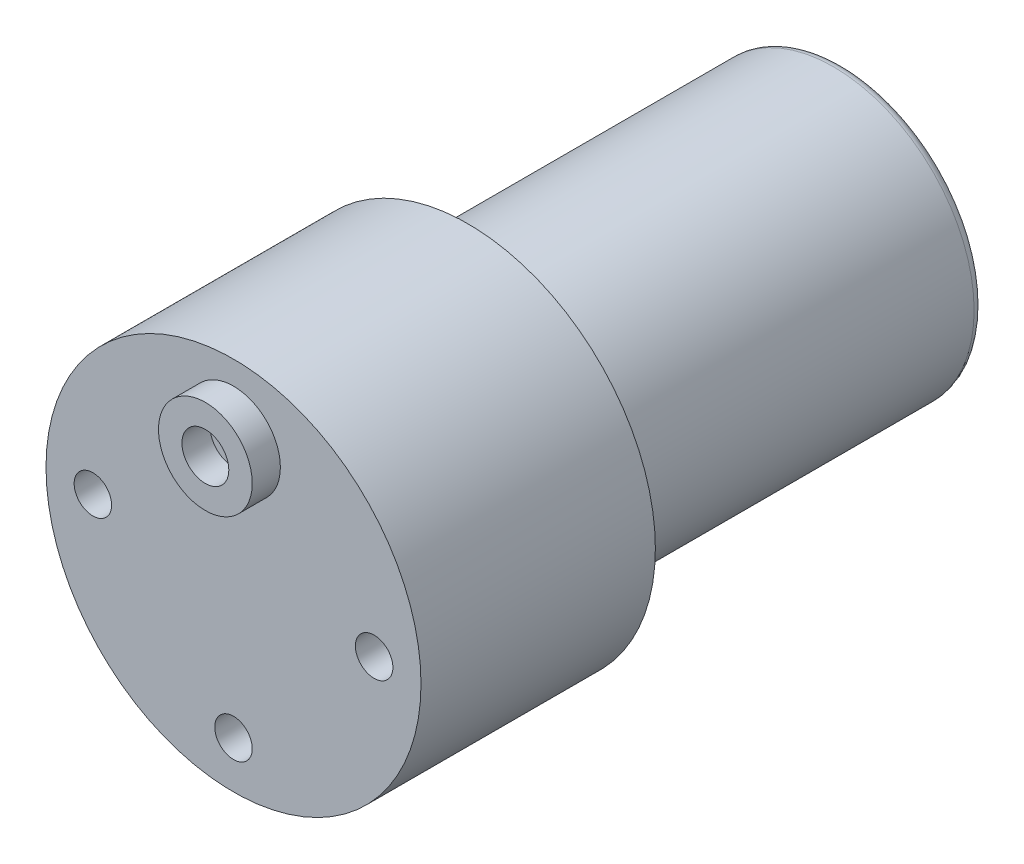
ISO-10303-21;
HEADER;
FILE_DESCRIPTION(('STEP AP214'),'2;1');
FILE_NAME('part.step','',(''),(''),'','','');
FILE_SCHEMA(('AUTOMOTIVE_DESIGN { 1 0 10303 214 1 1 1 1 }'));
ENDSEC;
DATA;
#1=APPLICATION_CONTEXT('core data for automotive mechanical design processes');
#2=APPLICATION_PROTOCOL_DEFINITION('international standard','automotive_design',2000,#1);
#3=PRODUCT_CONTEXT('',#1,'mechanical');
#4=PRODUCT('Part','Part','',(#3));
#5=PRODUCT_RELATED_PRODUCT_CATEGORY('part','',(#4));
#6=PRODUCT_DEFINITION_FORMATION('','',#4);
#7=PRODUCT_DEFINITION_CONTEXT('part definition',#1,'design');
#8=PRODUCT_DEFINITION('design','',#6,#7);
#9=PRODUCT_DEFINITION_SHAPE('','',#8);
#10=(LENGTH_UNIT() NAMED_UNIT(*) SI_UNIT(.MILLI.,.METRE.));
#11=(NAMED_UNIT(*) PLANE_ANGLE_UNIT() SI_UNIT($,.RADIAN.));
#12=(NAMED_UNIT(*) SI_UNIT($,.STERADIAN.) SOLID_ANGLE_UNIT());
#13=UNCERTAINTY_MEASURE_WITH_UNIT(LENGTH_MEASURE(1.E-05),#10,'distance_accuracy_value','');
#14=(GEOMETRIC_REPRESENTATION_CONTEXT(3) GLOBAL_UNCERTAINTY_ASSIGNED_CONTEXT((#13)) GLOBAL_UNIT_ASSIGNED_CONTEXT((#10,
#11,#12)) REPRESENTATION_CONTEXT('',''));
#15=CARTESIAN_POINT('',(0.,0.,0.));
#16=DIRECTION('',(0.,0.,1.));
#17=DIRECTION('',(1.,0.,0.));
#18=AXIS2_PLACEMENT_3D('',#15,#16,#17);
#19=CARTESIAN_POINT('',(0.,0.,0.));
#20=DIRECTION('',(0.,0.,1.));
#21=DIRECTION('',(1.,0.,0.));
#22=AXIS2_PLACEMENT_3D('',#19,#20,#21);
#23=PLANE('',#22);
#24=CARTESIAN_POINT('',(0.,0.,0.));
#25=DIRECTION('',(0.,0.,1.));
#26=DIRECTION('',(1.,0.,0.));
#27=AXIS2_PLACEMENT_3D('',#24,#25,#26);
#28=CIRCLE('',#27,14.);
#29=CARTESIAN_POINT('',(14.,0.,0.));
#30=VERTEX_POINT('',#29);
#31=EDGE_CURVE('E11',#30,#30,#28,.F.);
#32=ORIENTED_EDGE('',*,*,#31,.T.);
#33=EDGE_LOOP('',(#32));
#34=FACE_BOUND('',#33,.T.);
#35=CARTESIAN_POINT('',(0.,0.,0.));
#36=DIRECTION('',(0.,0.,1.));
#37=DIRECTION('',(1.,0.,0.));
#38=AXIS2_PLACEMENT_3D('',#35,#36,#37);
#39=CIRCLE('',#38,0.884543567841177);
#40=CARTESIAN_POINT('',(0.884543567841177,0.,0.));
#41=VERTEX_POINT('',#40);
#42=EDGE_CURVE('E299',#41,#41,#39,.F.);
#43=ORIENTED_EDGE('',*,*,#42,.F.);
#44=EDGE_LOOP('',(#43));
#45=FACE_BOUND('',#44,.T.);
#46=CARTESIAN_POINT('',(0.,0.,0.));
#47=DIRECTION('',(0.,0.,-1.));
#48=DIRECTION('',(-1.,0.,0.));
#49=AXIS2_PLACEMENT_3D('',#46,#47,#48);
#50=CIRCLE('',#49,11.5058602878581);
#51=CARTESIAN_POINT('',(4.21173853395863,10.7072909498752,0.));
#52=VERTEX_POINT('',#51);
#53=CARTESIAN_POINT('',(11.5058602878581,0.,0.));
#54=VERTEX_POINT('',#53);
#55=EDGE_CURVE('E262',#52,#54,#50,.T.);
#56=ORIENTED_EDGE('',*,*,#55,.F.);
#57=DIRECTION('',(0.366051597063384,0.930594556338767,0.));
#58=VECTOR('',#57,1.);
#59=CARTESIAN_POINT('',(0.,0.,0.));
#60=LINE('',#59,#58);
#61=CARTESIAN_POINT('',(3.14924308074473,8.00616222149991,0.));
#62=VERTEX_POINT('',#61);
#63=EDGE_CURVE('E242',#62,#52,#60,.T.);
#64=ORIENTED_EDGE('',*,*,#63,.F.);
#65=CARTESIAN_POINT('',(0.,0.,0.));
#66=DIRECTION('',(0.,0.,-1.));
#67=DIRECTION('',(-1.,0.,0.));
#68=AXIS2_PLACEMENT_3D('',#65,#66,#67);
#69=CIRCLE('',#68,8.60327643974033);
#70=CARTESIAN_POINT('',(8.60327643974033,0.,0.));
#71=VERTEX_POINT('',#70);
#72=EDGE_CURVE('E253',#62,#71,#69,.T.);
#73=ORIENTED_EDGE('',*,*,#72,.T.);
#74=DIRECTION('',(1.,0.,0.));
#75=VECTOR('',#74,1.);
#76=CARTESIAN_POINT('',(0.,0.,0.));
#77=LINE('',#76,#75);
#78=EDGE_CURVE('E265',#71,#54,#77,.T.);
#79=ORIENTED_EDGE('',*,*,#78,.T.);
#80=EDGE_LOOP('',(#56,#64,#73,#79));
#81=FACE_BOUND('',#80,.T.);
#82=CARTESIAN_POINT('',(0.,0.,0.));
#83=DIRECTION('',(0.,0.,-1.));
#84=DIRECTION('',(-1.,0.,0.));
#85=AXIS2_PLACEMENT_3D('',#82,#83,#84);
#86=CIRCLE('',#85,11.5058602878581);
#87=CARTESIAN_POINT('',(10.7834674748527,-4.01268615549543,0.));
#88=VERTEX_POINT('',#87);
#89=CARTESIAN_POINT('',(0.,-11.5058602878581,0.));
#90=VERTEX_POINT('',#89);
#91=EDGE_CURVE('E232',#88,#90,#86,.T.);
#92=ORIENTED_EDGE('',*,*,#91,.F.);
#93=DIRECTION('',(0.937215228159188,-0.348751510543712,0.));
#94=VECTOR('',#93,1.);
#95=CARTESIAN_POINT('',(0.,0.,0.));
#96=LINE('',#95,#94);
#97=CARTESIAN_POINT('',(8.0631216913878,-3.00040565398457,0.));
#98=VERTEX_POINT('',#97);
#99=EDGE_CURVE('E186',#98,#88,#96,.T.);
#100=ORIENTED_EDGE('',*,*,#99,.F.);
#101=CARTESIAN_POINT('',(0.,0.,0.));
#102=DIRECTION('',(0.,0.,-1.));
#103=DIRECTION('',(-1.,0.,0.));
#104=AXIS2_PLACEMENT_3D('',#101,#102,#103);
#105=CIRCLE('',#104,8.60327643974033);
#106=CARTESIAN_POINT('',(0.,-8.60327643974033,0.));
#107=VERTEX_POINT('',#106);
#108=EDGE_CURVE('E223',#98,#107,#105,.T.);
#109=ORIENTED_EDGE('',*,*,#108,.T.);
#110=DIRECTION('',(0.,-1.,0.));
#111=VECTOR('',#110,1.);
#112=CARTESIAN_POINT('',(0.,0.,0.));
#113=LINE('',#112,#111);
#114=EDGE_CURVE('E235',#107,#90,#113,.T.);
#115=ORIENTED_EDGE('',*,*,#114,.T.);
#116=EDGE_LOOP('',(#92,#100,#109,#115));
#117=FACE_BOUND('',#116,.T.);
#118=CARTESIAN_POINT('',(0.,0.,0.));
#119=DIRECTION('',(0.,0.,-1.));
#120=DIRECTION('',(-1.,0.,0.));
#121=AXIS2_PLACEMENT_3D('',#118,#119,#120);
#122=CIRCLE('',#121,11.5058602878581);
#123=CARTESIAN_POINT('',(-4.01268615549543,-10.7834674748527,0.));
#124=VERTEX_POINT('',#123);
#125=CARTESIAN_POINT('',(-11.5058602878581,0.,0.));
#126=VERTEX_POINT('',#125);
#127=EDGE_CURVE('E179',#124,#126,#122,.T.);
#128=ORIENTED_EDGE('',*,*,#127,.F.);
#129=DIRECTION('',(-0.311725125450202,-0.950172324456493,0.));
#130=VECTOR('',#129,1.);
#131=CARTESIAN_POINT('',(-0.428780065375972,0.140670819628772,0.));
#132=LINE('',#131,#130);
#133=CARTESIAN_POINT('',(-3.10694566550822,-8.02267125901159,0.));
#134=VERTEX_POINT('',#133);
#135=EDGE_CURVE('E57',#134,#124,#132,.T.);
#136=ORIENTED_EDGE('',*,*,#135,.F.);
#137=CARTESIAN_POINT('',(0.,0.,0.));
#138=DIRECTION('',(0.,0.,-1.));
#139=DIRECTION('',(-1.,0.,0.));
#140=AXIS2_PLACEMENT_3D('',#137,#138,#139);
#141=CIRCLE('',#140,8.60327643974033);
#142=CARTESIAN_POINT('',(-8.60327643974033,0.,0.));
#143=VERTEX_POINT('',#142);
#144=EDGE_CURVE('E167',#134,#143,#141,.T.);
#145=ORIENTED_EDGE('',*,*,#144,.T.);
#146=DIRECTION('',(-1.,0.,0.));
#147=VECTOR('',#146,1.);
#148=CARTESIAN_POINT('',(0.,0.,0.));
#149=LINE('',#148,#147);
#150=EDGE_CURVE('E170',#143,#126,#149,.T.);
#151=ORIENTED_EDGE('',*,*,#150,.T.);
#152=EDGE_LOOP('',(#128,#136,#145,#151));
#153=FACE_BOUND('',#152,.T.);
#154=CARTESIAN_POINT('',(0.,0.,0.));
#155=DIRECTION('',(0.,0.,-1.));
#156=DIRECTION('',(-1.,0.,0.));
#157=AXIS2_PLACEMENT_3D('',#154,#155,#156);
#158=CIRCLE('',#157,8.60327643974033);
#159=CARTESIAN_POINT('',(-7.89783511164913,3.41182737661111,0.));
#160=VERTEX_POINT('',#159);
#161=CARTESIAN_POINT('',(0.,8.60327643974033,0.));
#162=VERTEX_POINT('',#161);
#163=EDGE_CURVE('E49',#160,#162,#158,.T.);
#164=ORIENTED_EDGE('',*,*,#163,.T.);
#165=DIRECTION('',(0.,1.,0.));
#166=VECTOR('',#165,1.);
#167=CARTESIAN_POINT('',(0.,0.,0.));
#168=LINE('',#167,#166);
#169=CARTESIAN_POINT('',(0.,11.5058602878581,0.));
#170=VERTEX_POINT('',#169);
#171=EDGE_CURVE('E194',#162,#170,#168,.T.);
#172=ORIENTED_EDGE('',*,*,#171,.T.);
#173=CARTESIAN_POINT('',(0.,0.,0.));
#174=DIRECTION('',(0.,0.,-1.));
#175=DIRECTION('',(-1.,0.,0.));
#176=AXIS2_PLACEMENT_3D('',#173,#174,#175);
#177=CIRCLE('',#176,11.5058602878581);
#178=CARTESIAN_POINT('',(-10.5624163082127,4.56291383829598,0.));
#179=VERTEX_POINT('',#178);
#180=EDGE_CURVE('E208',#179,#170,#177,.T.);
#181=ORIENTED_EDGE('',*,*,#180,.F.);
#182=DIRECTION('',(-0.918003177855287,0.396573026626365,0.));
#183=VECTOR('',#182,1.);
#184=CARTESIAN_POINT('',(0.,0.,0.));
#185=LINE('',#184,#183);
#186=EDGE_CURVE('E204',#160,#179,#185,.T.);
#187=ORIENTED_EDGE('',*,*,#186,.F.);
#188=EDGE_LOOP('',(#164,#172,#181,#187));
#189=FACE_BOUND('',#188,.T.);
#190=ADVANCED_FACE('F34',(#34,#45,#81,#117,#153,#189),#23,.F.);
#191=CARTESIAN_POINT('',(0.,0.,40.));
#192=DIRECTION('',(0.,0.,-1.));
#193=DIRECTION('',(-1.,0.,0.));
#194=AXIS2_PLACEMENT_3D('',#191,#192,#193);
#195=CYLINDRICAL_SURFACE('',#194,15.);
#196=CARTESIAN_POINT('',(0.,0.,1.));
#197=DIRECTION('',(0.,0.,1.));
#198=DIRECTION('',(1.,0.,0.));
#199=AXIS2_PLACEMENT_3D('',#196,#197,#198);
#200=CIRCLE('',#199,15.);
#201=CARTESIAN_POINT('',(15.,0.,1.));
#202=VERTEX_POINT('',#201);
#203=EDGE_CURVE('E42',#202,#202,#200,.T.);
#204=ORIENTED_EDGE('',*,*,#203,.T.);
#205=EDGE_LOOP('',(#204));
#206=FACE_BOUND('',#205,.T.);
#207=CARTESIAN_POINT('',(0.,0.,40.));
#208=DIRECTION('',(0.,0.,1.));
#209=DIRECTION('',(1.,0.,0.));
#210=AXIS2_PLACEMENT_3D('',#207,#208,#209);
#211=CIRCLE('',#210,15.);
#212=CARTESIAN_POINT('',(15.,0.,40.));
#213=VERTEX_POINT('',#212);
#214=EDGE_CURVE('E294',#213,#213,#211,.T.);
#215=ORIENTED_EDGE('',*,*,#214,.F.);
#216=EDGE_LOOP('',(#215));
#217=FACE_BOUND('',#216,.T.);
#218=ADVANCED_FACE('F307',(#206,#217),#195,.T.);
#219=CARTESIAN_POINT('',(0.,0.,65.));
#220=DIRECTION('',(0.,0.,-1.));
#221=DIRECTION('',(-1.,0.,0.));
#222=AXIS2_PLACEMENT_3D('',#219,#220,#221);
#223=CYLINDRICAL_SURFACE('',#222,20.);
#224=CARTESIAN_POINT('',(0.,0.,65.));
#225=DIRECTION('',(0.,0.,1.));
#226=DIRECTION('',(1.,0.,0.));
#227=AXIS2_PLACEMENT_3D('',#224,#225,#226);
#228=CIRCLE('',#227,20.);
#229=CARTESIAN_POINT('',(20.,0.,65.));
#230=VERTEX_POINT('',#229);
#231=EDGE_CURVE('E291',#230,#230,#228,.T.);
#232=ORIENTED_EDGE('',*,*,#231,.F.);
#233=EDGE_LOOP('',(#232));
#234=FACE_BOUND('',#233,.T.);
#235=CARTESIAN_POINT('',(0.,0.,40.));
#236=DIRECTION('',(0.,0.,1.));
#237=DIRECTION('',(1.,0.,0.));
#238=AXIS2_PLACEMENT_3D('',#235,#236,#237);
#239=CIRCLE('',#238,20.);
#240=CARTESIAN_POINT('',(20.,0.,40.));
#241=VERTEX_POINT('',#240);
#242=EDGE_CURVE('E290',#241,#241,#239,.T.);
#243=ORIENTED_EDGE('',*,*,#242,.T.);
#244=EDGE_LOOP('',(#243));
#245=FACE_BOUND('',#244,.T.);
#246=ADVANCED_FACE('F331',(#234,#245),#223,.T.);
#247=CARTESIAN_POINT('',(0.,0.,65.));
#248=DIRECTION('',(0.,0.,1.));
#249=DIRECTION('',(1.,0.,0.));
#250=AXIS2_PLACEMENT_3D('',#247,#248,#249);
#251=PLANE('',#250);
#252=CARTESIAN_POINT('',(-15.,0.,65.));
#253=DIRECTION('',(0.,0.,1.));
#254=DIRECTION('',(1.,0.,0.));
#255=AXIS2_PLACEMENT_3D('',#252,#253,#254);
#256=CIRCLE('',#255,2.);
#257=CARTESIAN_POINT('',(-13.,0.,65.));
#258=VERTEX_POINT('',#257);
#259=EDGE_CURVE('E457',#258,#258,#256,.T.);
#260=ORIENTED_EDGE('',*,*,#259,.F.);
#261=EDGE_LOOP('',(#260));
#262=FACE_BOUND('',#261,.T.);
#263=CARTESIAN_POINT('',(0.,-15.,65.));
#264=DIRECTION('',(0.,0.,1.));
#265=DIRECTION('',(1.,0.,0.));
#266=AXIS2_PLACEMENT_3D('',#263,#264,#265);
#267=CIRCLE('',#266,2.);
#268=CARTESIAN_POINT('',(2.,-15.,65.));
#269=VERTEX_POINT('',#268);
#270=EDGE_CURVE('E466',#269,#269,#267,.T.);
#271=ORIENTED_EDGE('',*,*,#270,.F.);
#272=EDGE_LOOP('',(#271));
#273=FACE_BOUND('',#272,.T.);
#274=CARTESIAN_POINT('',(15.,0.,65.));
#275=DIRECTION('',(0.,0.,1.));
#276=DIRECTION('',(1.,0.,0.));
#277=AXIS2_PLACEMENT_3D('',#274,#275,#276);
#278=CIRCLE('',#277,2.);
#279=CARTESIAN_POINT('',(17.,0.,65.));
#280=VERTEX_POINT('',#279);
#281=EDGE_CURVE('E173',#280,#280,#278,.T.);
#282=ORIENTED_EDGE('',*,*,#281,.F.);
#283=EDGE_LOOP('',(#282));
#284=FACE_BOUND('',#283,.T.);
#285=CARTESIAN_POINT('',(0.,12.5,65.));
#286=DIRECTION('',(0.,0.,1.));
#287=DIRECTION('',(1.,0.,0.));
#288=AXIS2_PLACEMENT_3D('',#285,#286,#287);
#289=CIRCLE('',#288,5.);
#290=CARTESIAN_POINT('',(5.,12.5,65.));
#291=VERTEX_POINT('',#290);
#292=EDGE_CURVE('E281',#291,#291,#289,.T.);
#293=ORIENTED_EDGE('',*,*,#292,.F.);
#294=EDGE_LOOP('',(#293));
#295=FACE_BOUND('',#294,.T.);
#296=ORIENTED_EDGE('',*,*,#231,.T.);
#297=EDGE_LOOP('',(#296));
#298=FACE_BOUND('',#297,.T.);
#299=ADVANCED_FACE('F336',(#262,#273,#284,#295,#298),#251,.T.);
#300=CARTESIAN_POINT('',(0.,0.,40.));
#301=DIRECTION('',(0.,0.,1.));
#302=DIRECTION('',(1.,0.,0.));
#303=AXIS2_PLACEMENT_3D('',#300,#301,#302);
#304=PLANE('',#303);
#305=ORIENTED_EDGE('',*,*,#214,.T.);
#306=EDGE_LOOP('',(#305));
#307=FACE_BOUND('',#306,.T.);
#308=ORIENTED_EDGE('',*,*,#242,.F.);
#309=EDGE_LOOP('',(#308));
#310=FACE_BOUND('',#309,.T.);
#311=ADVANCED_FACE('F338',(#307,#310),#304,.F.);
#312=CARTESIAN_POINT('',(0.,0.,-3.));
#313=DIRECTION('',(0.,0.,1.));
#314=DIRECTION('',(1.,0.,0.));
#315=AXIS2_PLACEMENT_3D('',#312,#313,#314);
#316=CYLINDRICAL_SURFACE('',#315,0.884543567841177);
#317=CARTESIAN_POINT('',(0.,0.,-3.));
#318=DIRECTION('',(0.,0.,-1.));
#319=DIRECTION('',(-1.,0.,0.));
#320=AXIS2_PLACEMENT_3D('',#317,#318,#319);
#321=CIRCLE('',#320,0.884543567841177);
#322=CARTESIAN_POINT('',(-0.884543567841177,0.,-3.));
#323=VERTEX_POINT('',#322);
#324=EDGE_CURVE('E285',#323,#323,#321,.T.);
#325=ORIENTED_EDGE('',*,*,#324,.F.);
#326=EDGE_LOOP('',(#325));
#327=FACE_BOUND('',#326,.T.);
#328=ORIENTED_EDGE('',*,*,#42,.T.);
#329=EDGE_LOOP('',(#328));
#330=FACE_BOUND('',#329,.T.);
#331=ADVANCED_FACE('F341',(#327,#330),#316,.T.);
#332=CARTESIAN_POINT('',(0.,0.,-3.));
#333=DIRECTION('',(0.,0.,-1.));
#334=DIRECTION('',(-1.,0.,0.));
#335=AXIS2_PLACEMENT_3D('',#332,#333,#334);
#336=PLANE('',#335);
#337=ORIENTED_EDGE('',*,*,#324,.T.);
#338=EDGE_LOOP('',(#337));
#339=FACE_BOUND('',#338,.T.);
#340=ADVANCED_FACE('F349',(#339),#336,.T.);
#341=CARTESIAN_POINT('',(0.,12.5,68.));
#342=DIRECTION('',(0.,0.,1.));
#343=DIRECTION('',(1.,0.,0.));
#344=AXIS2_PLACEMENT_3D('',#341,#342,#343);
#345=PLANE('',#344);
#346=CARTESIAN_POINT('',(0.,12.5,68.));
#347=DIRECTION('',(0.,0.,1.));
#348=DIRECTION('',(1.,0.,0.));
#349=AXIS2_PLACEMENT_3D('',#346,#347,#348);
#350=CIRCLE('',#349,5.);
#351=CARTESIAN_POINT('',(5.,12.5,68.));
#352=VERTEX_POINT('',#351);
#353=EDGE_CURVE('E282',#352,#352,#350,.T.);
#354=ORIENTED_EDGE('',*,*,#353,.T.);
#355=EDGE_LOOP('',(#354));
#356=FACE_BOUND('',#355,.T.);
#357=CARTESIAN_POINT('',(0.,12.5,68.));
#358=DIRECTION('',(0.,0.,1.));
#359=DIRECTION('',(1.,0.,0.));
#360=AXIS2_PLACEMENT_3D('',#357,#358,#359);
#361=CIRCLE('',#360,2.5);
#362=CARTESIAN_POINT('',(2.5,12.5,68.));
#363=VERTEX_POINT('',#362);
#364=EDGE_CURVE('E272',#363,#363,#361,.T.);
#365=ORIENTED_EDGE('',*,*,#364,.F.);
#366=EDGE_LOOP('',(#365));
#367=FACE_BOUND('',#366,.T.);
#368=ADVANCED_FACE('F353',(#356,#367),#345,.T.);
#369=CARTESIAN_POINT('',(0.,12.5,68.));
#370=DIRECTION('',(0.,0.,-1.));
#371=DIRECTION('',(-1.,0.,0.));
#372=AXIS2_PLACEMENT_3D('',#369,#370,#371);
#373=CYLINDRICAL_SURFACE('',#372,5.);
#374=ORIENTED_EDGE('',*,*,#353,.F.);
#375=EDGE_LOOP('',(#374));
#376=FACE_BOUND('',#375,.T.);
#377=ORIENTED_EDGE('',*,*,#292,.T.);
#378=EDGE_LOOP('',(#377));
#379=FACE_BOUND('',#378,.T.);
#380=ADVANCED_FACE('F355',(#376,#379),#373,.T.);
#381=CARTESIAN_POINT('',(0.,12.5,68.));
#382=DIRECTION('',(0.,0.,-1.));
#383=DIRECTION('',(-1.,0.,0.));
#384=AXIS2_PLACEMENT_3D('',#381,#382,#383);
#385=CYLINDRICAL_SURFACE('',#384,2.5);
#386=ORIENTED_EDGE('',*,*,#364,.T.);
#387=EDGE_LOOP('',(#386));
#388=FACE_BOUND('',#387,.T.);
#389=CARTESIAN_POINT('',(0.,12.5,65.));
#390=DIRECTION('',(0.,0.,1.));
#391=DIRECTION('',(1.,0.,0.));
#392=AXIS2_PLACEMENT_3D('',#389,#390,#391);
#393=CIRCLE('',#392,2.5);
#394=CARTESIAN_POINT('',(2.5,12.5,65.));
#395=VERTEX_POINT('',#394);
#396=EDGE_CURVE('E302',#395,#395,#393,.F.);
#397=ORIENTED_EDGE('',*,*,#396,.T.);
#398=EDGE_LOOP('',(#397));
#399=FACE_BOUND('',#398,.T.);
#400=ADVANCED_FACE('F358',(#388,#399),#385,.F.);
#401=ORIENTED_EDGE('',*,*,#396,.F.);
#402=EDGE_LOOP('',(#401));
#403=FACE_BOUND('',#402,.T.);
#404=ADVANCED_FACE('F346',(#403),#251,.T.);
#405=CARTESIAN_POINT('',(0.,0.,3.));
#406=DIRECTION('',(-0.930594556338767,0.366051597063384,0.));
#407=DIRECTION('',(-0.366051597063384,-0.930594556338767,0.));
#408=AXIS2_PLACEMENT_3D('',#405,#406,#407);
#409=PLANE('',#408);
#410=ORIENTED_EDGE('',*,*,#63,.T.);
#411=DIRECTION('',(0.,0.,-1.));
#412=VECTOR('',#411,1.);
#413=CARTESIAN_POINT('',(4.21173853395863,10.7072909498752,3.));
#414=LINE('',#413,#412);
#415=CARTESIAN_POINT('',(4.21173853395863,10.7072909498752,3.));
#416=VERTEX_POINT('',#415);
#417=EDGE_CURVE('E260',#416,#52,#414,.T.);
#418=ORIENTED_EDGE('',*,*,#417,.F.);
#419=DIRECTION('',(0.366051597063384,0.930594556338767,0.));
#420=VECTOR('',#419,1.);
#421=CARTESIAN_POINT('',(0.,0.,3.));
#422=LINE('',#421,#420);
#423=CARTESIAN_POINT('',(3.14924308074473,8.00616222149991,3.));
#424=VERTEX_POINT('',#423);
#425=EDGE_CURVE('E249',#424,#416,#422,.T.);
#426=ORIENTED_EDGE('',*,*,#425,.F.);
#427=DIRECTION('',(0.,0.,-1.));
#428=VECTOR('',#427,1.);
#429=CARTESIAN_POINT('',(3.14924308074473,8.00616222149991,3.));
#430=LINE('',#429,#428);
#431=EDGE_CURVE('E270',#424,#62,#430,.T.);
#432=ORIENTED_EDGE('',*,*,#431,.T.);
#433=EDGE_LOOP('',(#410,#418,#426,#432));
#434=FACE_BOUND('',#433,.T.);
#435=ADVANCED_FACE('F366',(#434),#409,.F.);
#436=CARTESIAN_POINT('',(0.,0.,3.));
#437=DIRECTION('',(0.,0.,-1.));
#438=DIRECTION('',(-1.,0.,0.));
#439=AXIS2_PLACEMENT_3D('',#436,#437,#438);
#440=CYLINDRICAL_SURFACE('',#439,8.60327643974033);
#441=ORIENTED_EDGE('',*,*,#72,.F.);
#442=ORIENTED_EDGE('',*,*,#431,.F.);
#443=CARTESIAN_POINT('',(0.,0.,3.));
#444=DIRECTION('',(0.,0.,-1.));
#445=DIRECTION('',(-1.,0.,0.));
#446=AXIS2_PLACEMENT_3D('',#443,#444,#445);
#447=CIRCLE('',#446,8.60327643974033);
#448=CARTESIAN_POINT('',(8.60327643974033,0.,3.));
#449=VERTEX_POINT('',#448);
#450=EDGE_CURVE('E258',#424,#449,#447,.T.);
#451=ORIENTED_EDGE('',*,*,#450,.T.);
#452=DIRECTION('',(0.,0.,-1.));
#453=VECTOR('',#452,1.);
#454=CARTESIAN_POINT('',(8.60327643974033,0.,3.));
#455=LINE('',#454,#453);
#456=EDGE_CURVE('E273',#449,#71,#455,.T.);
#457=ORIENTED_EDGE('',*,*,#456,.T.);
#458=EDGE_LOOP('',(#441,#442,#451,#457));
#459=FACE_BOUND('',#458,.T.);
#460=ADVANCED_FACE('F369',(#459),#440,.T.);
#461=CARTESIAN_POINT('',(0.,0.,3.));
#462=DIRECTION('',(0.,1.,0.));
#463=DIRECTION('',(0.,0.,1.));
#464=AXIS2_PLACEMENT_3D('',#461,#462,#463);
#465=PLANE('',#464);
#466=ORIENTED_EDGE('',*,*,#78,.F.);
#467=ORIENTED_EDGE('',*,*,#456,.F.);
#468=DIRECTION('',(1.,0.,0.));
#469=VECTOR('',#468,1.);
#470=CARTESIAN_POINT('',(0.,0.,3.));
#471=LINE('',#470,#469);
#472=CARTESIAN_POINT('',(11.5058602878581,0.,3.));
#473=VERTEX_POINT('',#472);
#474=EDGE_CURVE('E256',#449,#473,#471,.T.);
#475=ORIENTED_EDGE('',*,*,#474,.T.);
#476=DIRECTION('',(0.,0.,-1.));
#477=VECTOR('',#476,1.);
#478=CARTESIAN_POINT('',(11.5058602878581,0.,3.));
#479=LINE('',#478,#477);
#480=EDGE_CURVE('E275',#473,#54,#479,.T.);
#481=ORIENTED_EDGE('',*,*,#480,.T.);
#482=EDGE_LOOP('',(#466,#467,#475,#481));
#483=FACE_BOUND('',#482,.T.);
#484=ADVANCED_FACE('F375',(#483),#465,.T.);
#485=CARTESIAN_POINT('',(0.,0.,3.));
#486=DIRECTION('',(0.,0.,-1.));
#487=DIRECTION('',(-1.,0.,0.));
#488=AXIS2_PLACEMENT_3D('',#485,#486,#487);
#489=CYLINDRICAL_SURFACE('',#488,11.5058602878581);
#490=ORIENTED_EDGE('',*,*,#55,.T.);
#491=ORIENTED_EDGE('',*,*,#480,.F.);
#492=CARTESIAN_POINT('',(0.,0.,3.));
#493=DIRECTION('',(0.,0.,-1.));
#494=DIRECTION('',(-1.,0.,0.));
#495=AXIS2_PLACEMENT_3D('',#492,#493,#494);
#496=CIRCLE('',#495,11.5058602878581);
#497=EDGE_CURVE('E252',#416,#473,#496,.T.);
#498=ORIENTED_EDGE('',*,*,#497,.F.);
#499=ORIENTED_EDGE('',*,*,#417,.T.);
#500=EDGE_LOOP('',(#490,#491,#498,#499));
#501=FACE_BOUND('',#500,.T.);
#502=ADVANCED_FACE('F371',(#501),#489,.F.);
#503=CARTESIAN_POINT('',(0.,0.,3.));
#504=DIRECTION('',(0.,0.,-1.));
#505=DIRECTION('',(-1.,0.,0.));
#506=AXIS2_PLACEMENT_3D('',#503,#504,#505);
#507=PLANE('',#506);
#508=ORIENTED_EDGE('',*,*,#425,.T.);
#509=ORIENTED_EDGE('',*,*,#497,.T.);
#510=ORIENTED_EDGE('',*,*,#474,.F.);
#511=ORIENTED_EDGE('',*,*,#450,.F.);
#512=EDGE_LOOP('',(#508,#509,#510,#511));
#513=FACE_BOUND('',#512,.T.);
#514=ADVANCED_FACE('F374',(#513),#507,.T.);
#515=CARTESIAN_POINT('',(0.,0.,3.));
#516=DIRECTION('',(0.348751510543712,0.937215228159188,0.));
#517=DIRECTION('',(-0.937215228159188,0.348751510543712,0.));
#518=AXIS2_PLACEMENT_3D('',#515,#516,#517);
#519=PLANE('',#518);
#520=ORIENTED_EDGE('',*,*,#99,.T.);
#521=DIRECTION('',(0.,0.,-1.));
#522=VECTOR('',#521,1.);
#523=CARTESIAN_POINT('',(10.7834674748527,-4.01268615549543,3.));
#524=LINE('',#523,#522);
#525=CARTESIAN_POINT('',(10.7834674748527,-4.01268615549543,3.));
#526=VERTEX_POINT('',#525);
#527=EDGE_CURVE('E230',#526,#88,#524,.T.);
#528=ORIENTED_EDGE('',*,*,#527,.F.);
#529=DIRECTION('',(0.937215228159188,-0.348751510543712,0.));
#530=VECTOR('',#529,1.);
#531=CARTESIAN_POINT('',(0.,0.,3.));
#532=LINE('',#531,#530);
#533=CARTESIAN_POINT('',(8.0631216913878,-3.00040565398457,3.));
#534=VERTEX_POINT('',#533);
#535=EDGE_CURVE('E219',#534,#526,#532,.T.);
#536=ORIENTED_EDGE('',*,*,#535,.F.);
#537=DIRECTION('',(0.,0.,-1.));
#538=VECTOR('',#537,1.);
#539=CARTESIAN_POINT('',(8.0631216913878,-3.00040565398457,3.));
#540=LINE('',#539,#538);
#541=EDGE_CURVE('E240',#534,#98,#540,.T.);
#542=ORIENTED_EDGE('',*,*,#541,.T.);
#543=EDGE_LOOP('',(#520,#528,#536,#542));
#544=FACE_BOUND('',#543,.T.);
#545=ADVANCED_FACE('F385',(#544),#519,.F.);
#546=CARTESIAN_POINT('',(0.,0.,3.));
#547=DIRECTION('',(0.,0.,-1.));
#548=DIRECTION('',(-1.,0.,0.));
#549=AXIS2_PLACEMENT_3D('',#546,#547,#548);
#550=CYLINDRICAL_SURFACE('',#549,8.60327643974033);
#551=ORIENTED_EDGE('',*,*,#108,.F.);
#552=ORIENTED_EDGE('',*,*,#541,.F.);
#553=CARTESIAN_POINT('',(0.,0.,3.));
#554=DIRECTION('',(0.,0.,-1.));
#555=DIRECTION('',(-1.,0.,0.));
#556=AXIS2_PLACEMENT_3D('',#553,#554,#555);
#557=CIRCLE('',#556,8.60327643974033);
#558=CARTESIAN_POINT('',(0.,-8.60327643974033,3.));
#559=VERTEX_POINT('',#558);
#560=EDGE_CURVE('E228',#534,#559,#557,.T.);
#561=ORIENTED_EDGE('',*,*,#560,.T.);
#562=DIRECTION('',(0.,0.,-1.));
#563=VECTOR('',#562,1.);
#564=CARTESIAN_POINT('',(0.,-8.60327643974033,3.));
#565=LINE('',#564,#563);
#566=EDGE_CURVE('E243',#559,#107,#565,.T.);
#567=ORIENTED_EDGE('',*,*,#566,.T.);
#568=EDGE_LOOP('',(#551,#552,#561,#567));
#569=FACE_BOUND('',#568,.T.);
#570=ADVANCED_FACE('F389',(#569),#550,.T.);
#571=CARTESIAN_POINT('',(0.,0.,3.));
#572=DIRECTION('',(1.,0.,0.));
#573=DIRECTION('',(0.,0.,-1.));
#574=AXIS2_PLACEMENT_3D('',#571,#572,#573);
#575=PLANE('',#574);
#576=ORIENTED_EDGE('',*,*,#114,.F.);
#577=ORIENTED_EDGE('',*,*,#566,.F.);
#578=DIRECTION('',(0.,-1.,0.));
#579=VECTOR('',#578,1.);
#580=CARTESIAN_POINT('',(0.,0.,3.));
#581=LINE('',#580,#579);
#582=CARTESIAN_POINT('',(0.,-11.5058602878581,3.));
#583=VERTEX_POINT('',#582);
#584=EDGE_CURVE('E226',#559,#583,#581,.T.);
#585=ORIENTED_EDGE('',*,*,#584,.T.);
#586=DIRECTION('',(0.,0.,-1.));
#587=VECTOR('',#586,1.);
#588=CARTESIAN_POINT('',(0.,-11.5058602878581,3.));
#589=LINE('',#588,#587);
#590=EDGE_CURVE('E245',#583,#90,#589,.T.);
#591=ORIENTED_EDGE('',*,*,#590,.T.);
#592=EDGE_LOOP('',(#576,#577,#585,#591));
#593=FACE_BOUND('',#592,.T.);
#594=ADVANCED_FACE('F395',(#593),#575,.T.);
#595=CARTESIAN_POINT('',(0.,0.,3.));
#596=DIRECTION('',(0.,0.,-1.));
#597=DIRECTION('',(-1.,0.,0.));
#598=AXIS2_PLACEMENT_3D('',#595,#596,#597);
#599=CYLINDRICAL_SURFACE('',#598,11.5058602878581);
#600=ORIENTED_EDGE('',*,*,#91,.T.);
#601=ORIENTED_EDGE('',*,*,#590,.F.);
#602=CARTESIAN_POINT('',(0.,0.,3.));
#603=DIRECTION('',(0.,0.,-1.));
#604=DIRECTION('',(-1.,0.,0.));
#605=AXIS2_PLACEMENT_3D('',#602,#603,#604);
#606=CIRCLE('',#605,11.5058602878581);
#607=EDGE_CURVE('E222',#526,#583,#606,.T.);
#608=ORIENTED_EDGE('',*,*,#607,.F.);
#609=ORIENTED_EDGE('',*,*,#527,.T.);
#610=EDGE_LOOP('',(#600,#601,#608,#609));
#611=FACE_BOUND('',#610,.T.);
#612=ADVANCED_FACE('F391',(#611),#599,.F.);
#613=CARTESIAN_POINT('',(0.,0.,3.));
#614=DIRECTION('',(0.,0.,-1.));
#615=DIRECTION('',(-1.,0.,0.));
#616=AXIS2_PLACEMENT_3D('',#613,#614,#615);
#617=PLANE('',#616);
#618=ORIENTED_EDGE('',*,*,#535,.T.);
#619=ORIENTED_EDGE('',*,*,#607,.T.);
#620=ORIENTED_EDGE('',*,*,#584,.F.);
#621=ORIENTED_EDGE('',*,*,#560,.F.);
#622=EDGE_LOOP('',(#618,#619,#620,#621));
#623=FACE_BOUND('',#622,.T.);
#624=ADVANCED_FACE('F394',(#623),#617,.T.);
#625=CARTESIAN_POINT('',(-0.428780065375972,0.140670819628772,3.));
#626=DIRECTION('',(0.950172324456493,-0.311725125450202,0.));
#627=DIRECTION('',(0.311725125450202,0.950172324456493,0.));
#628=AXIS2_PLACEMENT_3D('',#625,#626,#627);
#629=PLANE('',#628);
#630=ORIENTED_EDGE('',*,*,#135,.T.);
#631=DIRECTION('',(0.,0.,-1.));
#632=VECTOR('',#631,1.);
#633=CARTESIAN_POINT('',(-4.01268615549543,-10.7834674748527,3.));
#634=LINE('',#633,#632);
#635=CARTESIAN_POINT('',(-4.01268615549543,-10.7834674748527,3.));
#636=VERTEX_POINT('',#635);
#637=EDGE_CURVE('E146',#636,#124,#634,.T.);
#638=ORIENTED_EDGE('',*,*,#637,.F.);
#639=DIRECTION('',(-0.311725125450202,-0.950172324456493,0.));
#640=VECTOR('',#639,1.);
#641=CARTESIAN_POINT('',(-0.428780065375972,0.140670819628772,3.));
#642=LINE('',#641,#640);
#643=CARTESIAN_POINT('',(-3.10694566550822,-8.02267125901159,3.));
#644=VERTEX_POINT('',#643);
#645=EDGE_CURVE('E150',#644,#636,#642,.T.);
#646=ORIENTED_EDGE('',*,*,#645,.F.);
#647=DIRECTION('',(0.,0.,-1.));
#648=VECTOR('',#647,1.);
#649=CARTESIAN_POINT('',(-3.10694566550822,-8.02267125901159,3.));
#650=LINE('',#649,#648);
#651=EDGE_CURVE('E184',#644,#134,#650,.T.);
#652=ORIENTED_EDGE('',*,*,#651,.T.);
#653=EDGE_LOOP('',(#630,#638,#646,#652));
#654=FACE_BOUND('',#653,.T.);
#655=ADVANCED_FACE('F148',(#654),#629,.F.);
#656=CARTESIAN_POINT('',(0.,0.,3.));
#657=DIRECTION('',(0.,0.,-1.));
#658=DIRECTION('',(-1.,0.,0.));
#659=AXIS2_PLACEMENT_3D('',#656,#657,#658);
#660=CYLINDRICAL_SURFACE('',#659,8.60327643974033);
#661=ORIENTED_EDGE('',*,*,#144,.F.);
#662=ORIENTED_EDGE('',*,*,#651,.F.);
#663=CARTESIAN_POINT('',(0.,0.,3.));
#664=DIRECTION('',(0.,0.,-1.));
#665=DIRECTION('',(-1.,0.,0.));
#666=AXIS2_PLACEMENT_3D('',#663,#664,#665);
#667=CIRCLE('',#666,8.60327643974033);
#668=CARTESIAN_POINT('',(-8.60327643974033,0.,3.));
#669=VERTEX_POINT('',#668);
#670=EDGE_CURVE('E155',#644,#669,#667,.T.);
#671=ORIENTED_EDGE('',*,*,#670,.T.);
#672=DIRECTION('',(0.,0.,-1.));
#673=VECTOR('',#672,1.);
#674=CARTESIAN_POINT('',(-8.60327643974033,0.,3.));
#675=LINE('',#674,#673);
#676=EDGE_CURVE('E187',#669,#143,#675,.T.);
#677=ORIENTED_EDGE('',*,*,#676,.T.);
#678=EDGE_LOOP('',(#661,#662,#671,#677));
#679=FACE_BOUND('',#678,.T.);
#680=ADVANCED_FACE('F422',(#679),#660,.T.);
#681=CARTESIAN_POINT('',(0.,0.,3.));
#682=DIRECTION('',(0.,-1.,0.));
#683=DIRECTION('',(0.,0.,-1.));
#684=AXIS2_PLACEMENT_3D('',#681,#682,#683);
#685=PLANE('',#684);
#686=ORIENTED_EDGE('',*,*,#150,.F.);
#687=ORIENTED_EDGE('',*,*,#676,.F.);
#688=DIRECTION('',(-1.,0.,0.));
#689=VECTOR('',#688,1.);
#690=CARTESIAN_POINT('',(0.,0.,3.));
#691=LINE('',#690,#689);
#692=CARTESIAN_POINT('',(-11.5058602878581,0.,3.));
#693=VERTEX_POINT('',#692);
#694=EDGE_CURVE('E163',#669,#693,#691,.T.);
#695=ORIENTED_EDGE('',*,*,#694,.T.);
#696=DIRECTION('',(0.,0.,-1.));
#697=VECTOR('',#696,1.);
#698=CARTESIAN_POINT('',(-11.5058602878581,0.,3.));
#699=LINE('',#698,#697);
#700=EDGE_CURVE('E154',#693,#126,#699,.T.);
#701=ORIENTED_EDGE('',*,*,#700,.T.);
#702=EDGE_LOOP('',(#686,#687,#695,#701));
#703=FACE_BOUND('',#702,.T.);
#704=ADVANCED_FACE('F425',(#703),#685,.T.);
#705=CARTESIAN_POINT('',(0.,0.,3.));
#706=DIRECTION('',(0.,0.,-1.));
#707=DIRECTION('',(-1.,0.,0.));
#708=AXIS2_PLACEMENT_3D('',#705,#706,#707);
#709=CYLINDRICAL_SURFACE('',#708,11.5058602878581);
#710=ORIENTED_EDGE('',*,*,#127,.T.);
#711=ORIENTED_EDGE('',*,*,#700,.F.);
#712=CARTESIAN_POINT('',(0.,0.,3.));
#713=DIRECTION('',(0.,0.,-1.));
#714=DIRECTION('',(-1.,0.,0.));
#715=AXIS2_PLACEMENT_3D('',#712,#713,#714);
#716=CIRCLE('',#715,11.5058602878581);
#717=EDGE_CURVE('E159',#636,#693,#716,.T.);
#718=ORIENTED_EDGE('',*,*,#717,.F.);
#719=ORIENTED_EDGE('',*,*,#637,.T.);
#720=EDGE_LOOP('',(#710,#711,#718,#719));
#721=FACE_BOUND('',#720,.T.);
#722=ADVANCED_FACE('F160',(#721),#709,.F.);
#723=CARTESIAN_POINT('',(0.,0.,3.));
#724=DIRECTION('',(0.,0.,-1.));
#725=DIRECTION('',(-1.,0.,0.));
#726=AXIS2_PLACEMENT_3D('',#723,#724,#725);
#727=PLANE('',#726);
#728=ORIENTED_EDGE('',*,*,#645,.T.);
#729=ORIENTED_EDGE('',*,*,#717,.T.);
#730=ORIENTED_EDGE('',*,*,#694,.F.);
#731=ORIENTED_EDGE('',*,*,#670,.F.);
#732=EDGE_LOOP('',(#728,#729,#730,#731));
#733=FACE_BOUND('',#732,.T.);
#734=ADVANCED_FACE('F166',(#733),#727,.T.);
#735=CARTESIAN_POINT('',(0.,0.,3.));
#736=DIRECTION('',(0.,0.,-1.));
#737=DIRECTION('',(-1.,0.,0.));
#738=AXIS2_PLACEMENT_3D('',#735,#736,#737);
#739=CYLINDRICAL_SURFACE('',#738,8.60327643974033);
#740=ORIENTED_EDGE('',*,*,#163,.F.);
#741=DIRECTION('',(0.,0.,-1.));
#742=VECTOR('',#741,1.);
#743=CARTESIAN_POINT('',(-7.89783511164913,3.41182737661111,3.));
#744=LINE('',#743,#742);
#745=CARTESIAN_POINT('',(-7.89783511164913,3.41182737661111,3.));
#746=VERTEX_POINT('',#745);
#747=EDGE_CURVE('E202',#746,#160,#744,.T.);
#748=ORIENTED_EDGE('',*,*,#747,.F.);
#749=CARTESIAN_POINT('',(0.,0.,3.));
#750=DIRECTION('',(0.,0.,-1.));
#751=DIRECTION('',(-1.,0.,0.));
#752=AXIS2_PLACEMENT_3D('',#749,#750,#751);
#753=CIRCLE('',#752,8.60327643974033);
#754=CARTESIAN_POINT('',(0.,8.60327643974033,3.));
#755=VERTEX_POINT('',#754);
#756=EDGE_CURVE('E190',#746,#755,#753,.T.);
#757=ORIENTED_EDGE('',*,*,#756,.T.);
#758=DIRECTION('',(0.,0.,-1.));
#759=VECTOR('',#758,1.);
#760=CARTESIAN_POINT('',(0.,8.60327643974033,3.));
#761=LINE('',#760,#759);
#762=EDGE_CURVE('E180',#755,#162,#761,.T.);
#763=ORIENTED_EDGE('',*,*,#762,.T.);
#764=EDGE_LOOP('',(#740,#748,#757,#763));
#765=FACE_BOUND('',#764,.T.);
#766=ADVANCED_FACE('F406',(#765),#739,.T.);
#767=CARTESIAN_POINT('',(0.,0.,3.));
#768=DIRECTION('',(-1.,0.,0.));
#769=DIRECTION('',(0.,0.,1.));
#770=AXIS2_PLACEMENT_3D('',#767,#768,#769);
#771=PLANE('',#770);
#772=ORIENTED_EDGE('',*,*,#171,.F.);
#773=ORIENTED_EDGE('',*,*,#762,.F.);
#774=DIRECTION('',(0.,1.,0.));
#775=VECTOR('',#774,1.);
#776=CARTESIAN_POINT('',(0.,0.,3.));
#777=LINE('',#776,#775);
#778=CARTESIAN_POINT('',(0.,11.5058602878581,3.));
#779=VERTEX_POINT('',#778);
#780=EDGE_CURVE('E200',#755,#779,#777,.T.);
#781=ORIENTED_EDGE('',*,*,#780,.T.);
#782=DIRECTION('',(0.,0.,-1.));
#783=VECTOR('',#782,1.);
#784=CARTESIAN_POINT('',(0.,11.5058602878581,3.));
#785=LINE('',#784,#783);
#786=EDGE_CURVE('E214',#779,#170,#785,.T.);
#787=ORIENTED_EDGE('',*,*,#786,.T.);
#788=EDGE_LOOP('',(#772,#773,#781,#787));
#789=FACE_BOUND('',#788,.T.);
#790=ADVANCED_FACE('F409',(#789),#771,.T.);
#791=CARTESIAN_POINT('',(0.,0.,3.));
#792=DIRECTION('',(0.,0.,-1.));
#793=DIRECTION('',(-1.,0.,0.));
#794=AXIS2_PLACEMENT_3D('',#791,#792,#793);
#795=CYLINDRICAL_SURFACE('',#794,11.5058602878581);
#796=ORIENTED_EDGE('',*,*,#180,.T.);
#797=ORIENTED_EDGE('',*,*,#786,.F.);
#798=CARTESIAN_POINT('',(0.,0.,3.));
#799=DIRECTION('',(0.,0.,-1.));
#800=DIRECTION('',(-1.,0.,0.));
#801=AXIS2_PLACEMENT_3D('',#798,#799,#800);
#802=CIRCLE('',#801,11.5058602878581);
#803=CARTESIAN_POINT('',(-10.5624163082127,4.56291383829598,3.));
#804=VERTEX_POINT('',#803);
#805=EDGE_CURVE('E197',#804,#779,#802,.T.);
#806=ORIENTED_EDGE('',*,*,#805,.F.);
#807=DIRECTION('',(0.,0.,-1.));
#808=VECTOR('',#807,1.);
#809=CARTESIAN_POINT('',(-10.5624163082127,4.56291383829598,3.));
#810=LINE('',#809,#808);
#811=EDGE_CURVE('E216',#804,#179,#810,.T.);
#812=ORIENTED_EDGE('',*,*,#811,.T.);
#813=EDGE_LOOP('',(#796,#797,#806,#812));
#814=FACE_BOUND('',#813,.T.);
#815=ADVANCED_FACE('F412',(#814),#795,.F.);
#816=CARTESIAN_POINT('',(0.,0.,3.));
#817=DIRECTION('',(-0.396573026626364,-0.918003177855286,0.));
#818=DIRECTION('',(0.918003177855287,-0.396573026626365,0.));
#819=AXIS2_PLACEMENT_3D('',#816,#817,#818);
#820=PLANE('',#819);
#821=ORIENTED_EDGE('',*,*,#186,.T.);
#822=ORIENTED_EDGE('',*,*,#811,.F.);
#823=DIRECTION('',(-0.918003177855287,0.396573026626365,0.));
#824=VECTOR('',#823,1.);
#825=CARTESIAN_POINT('',(0.,0.,3.));
#826=LINE('',#825,#824);
#827=EDGE_CURVE('E193',#746,#804,#826,.T.);
#828=ORIENTED_EDGE('',*,*,#827,.F.);
#829=ORIENTED_EDGE('',*,*,#747,.T.);
#830=EDGE_LOOP('',(#821,#822,#828,#829));
#831=FACE_BOUND('',#830,.T.);
#832=ADVANCED_FACE('F321',(#831),#820,.F.);
#833=CARTESIAN_POINT('',(0.,0.,3.));
#834=DIRECTION('',(0.,0.,-1.));
#835=DIRECTION('',(-1.,0.,0.));
#836=AXIS2_PLACEMENT_3D('',#833,#834,#835);
#837=PLANE('',#836);
#838=ORIENTED_EDGE('',*,*,#756,.F.);
#839=ORIENTED_EDGE('',*,*,#827,.T.);
#840=ORIENTED_EDGE('',*,*,#805,.T.);
#841=ORIENTED_EDGE('',*,*,#780,.F.);
#842=EDGE_LOOP('',(#838,#839,#840,#841));
#843=FACE_BOUND('',#842,.T.);
#844=ADVANCED_FACE('F312',(#843),#837,.T.);
#845=CARTESIAN_POINT('',(0.,0.,1.));
#846=DIRECTION('',(0.,0.,1.));
#847=DIRECTION('',(1.,0.,0.));
#848=AXIS2_PLACEMENT_3D('',#845,#846,#847);
#849=TOROIDAL_SURFACE('',#848,14.,1.);
#850=ORIENTED_EDGE('',*,*,#31,.F.);
#851=EDGE_LOOP('',(#850));
#852=FACE_BOUND('',#851,.T.);
#853=ORIENTED_EDGE('',*,*,#203,.F.);
#854=EDGE_LOOP('',(#853));
#855=FACE_BOUND('',#854,.T.);
#856=ADVANCED_FACE('F36',(#852,#855),#849,.T.);
#857=CARTESIAN_POINT('',(15.,0.,55.));
#858=DIRECTION('',(0.,0.,1.));
#859=DIRECTION('',(1.,0.,0.));
#860=AXIS2_PLACEMENT_3D('',#857,#858,#859);
#861=CYLINDRICAL_SURFACE('',#860,2.);
#862=CARTESIAN_POINT('',(15.,0.,55.));
#863=DIRECTION('',(0.,0.,1.));
#864=DIRECTION('',(1.,0.,0.));
#865=AXIS2_PLACEMENT_3D('',#862,#863,#864);
#866=CIRCLE('',#865,2.);
#867=CARTESIAN_POINT('',(17.,0.,55.));
#868=VERTEX_POINT('',#867);
#869=EDGE_CURVE('E205',#868,#868,#866,.T.);
#870=ORIENTED_EDGE('',*,*,#869,.F.);
#871=EDGE_LOOP('',(#870));
#872=FACE_BOUND('',#871,.T.);
#873=ORIENTED_EDGE('',*,*,#281,.T.);
#874=EDGE_LOOP('',(#873));
#875=FACE_BOUND('',#874,.T.);
#876=ADVANCED_FACE('F311',(#872,#875),#861,.F.);
#877=CARTESIAN_POINT('',(15.,0.,55.));
#878=DIRECTION('',(0.,0.,1.));
#879=DIRECTION('',(1.,0.,0.));
#880=AXIS2_PLACEMENT_3D('',#877,#878,#879);
#881=PLANE('',#880);
#882=ORIENTED_EDGE('',*,*,#869,.T.);
#883=EDGE_LOOP('',(#882));
#884=FACE_BOUND('',#883,.T.);
#885=ADVANCED_FACE('F318',(#884),#881,.T.);
#886=CARTESIAN_POINT('',(0.,-15.,55.));
#887=DIRECTION('',(0.,0.,1.));
#888=DIRECTION('',(1.,0.,0.));
#889=AXIS2_PLACEMENT_3D('',#886,#887,#888);
#890=CYLINDRICAL_SURFACE('',#889,2.);
#891=CARTESIAN_POINT('',(0.,-15.,55.));
#892=DIRECTION('',(0.,0.,1.));
#893=DIRECTION('',(1.,0.,0.));
#894=AXIS2_PLACEMENT_3D('',#891,#892,#893);
#895=CIRCLE('',#894,2.);
#896=CARTESIAN_POINT('',(2.,-15.,55.));
#897=VERTEX_POINT('',#896);
#898=EDGE_CURVE('E461',#897,#897,#895,.T.);
#899=ORIENTED_EDGE('',*,*,#898,.F.);
#900=EDGE_LOOP('',(#899));
#901=FACE_BOUND('',#900,.T.);
#902=ORIENTED_EDGE('',*,*,#270,.T.);
#903=EDGE_LOOP('',(#902));
#904=FACE_BOUND('',#903,.T.);
#905=ADVANCED_FACE('F436',(#901,#904),#890,.F.);
#906=CARTESIAN_POINT('',(0.,-15.,55.));
#907=DIRECTION('',(0.,0.,1.));
#908=DIRECTION('',(1.,0.,0.));
#909=AXIS2_PLACEMENT_3D('',#906,#907,#908);
#910=PLANE('',#909);
#911=ORIENTED_EDGE('',*,*,#898,.T.);
#912=EDGE_LOOP('',(#911));
#913=FACE_BOUND('',#912,.T.);
#914=ADVANCED_FACE('F440',(#913),#910,.T.);
#915=CARTESIAN_POINT('',(-15.,0.,55.));
#916=DIRECTION('',(0.,0.,1.));
#917=DIRECTION('',(1.,0.,0.));
#918=AXIS2_PLACEMENT_3D('',#915,#916,#917);
#919=CYLINDRICAL_SURFACE('',#918,2.);
#920=CARTESIAN_POINT('',(-15.,0.,55.));
#921=DIRECTION('',(0.,0.,1.));
#922=DIRECTION('',(1.,0.,0.));
#923=AXIS2_PLACEMENT_3D('',#920,#921,#922);
#924=CIRCLE('',#923,2.);
#925=CARTESIAN_POINT('',(-13.,0.,55.));
#926=VERTEX_POINT('',#925);
#927=EDGE_CURVE('E456',#926,#926,#924,.T.);
#928=ORIENTED_EDGE('',*,*,#927,.F.);
#929=EDGE_LOOP('',(#928));
#930=FACE_BOUND('',#929,.T.);
#931=ORIENTED_EDGE('',*,*,#259,.T.);
#932=EDGE_LOOP('',(#931));
#933=FACE_BOUND('',#932,.T.);
#934=ADVANCED_FACE('F444',(#930,#933),#919,.F.);
#935=CARTESIAN_POINT('',(-15.,0.,55.));
#936=DIRECTION('',(0.,0.,1.));
#937=DIRECTION('',(1.,0.,0.));
#938=AXIS2_PLACEMENT_3D('',#935,#936,#937);
#939=PLANE('',#938);
#940=ORIENTED_EDGE('',*,*,#927,.T.);
#941=EDGE_LOOP('',(#940));
#942=FACE_BOUND('',#941,.T.);
#943=ADVANCED_FACE('F448',(#942),#939,.T.);
#944=CLOSED_SHELL('',(#190,#218,#246,#299,#311,#331,#340,#368,#380,#400,#404,#435,#460,#484,
#502,#514,#545,#570,#594,#612,#624,#655,#680,#704,#722,#734,#766,#790,#815,#832,#844,#856,#876,
#885,#905,#914,#934,#943));
#945=MANIFOLD_SOLID_BREP('B2',#944);
#946=ADVANCED_BREP_SHAPE_REPRESENTATION('',(#18,#945),#14);
#947=SHAPE_DEFINITION_REPRESENTATION(#9,#946);
ENDSEC;
END-ISO-10303-21;
